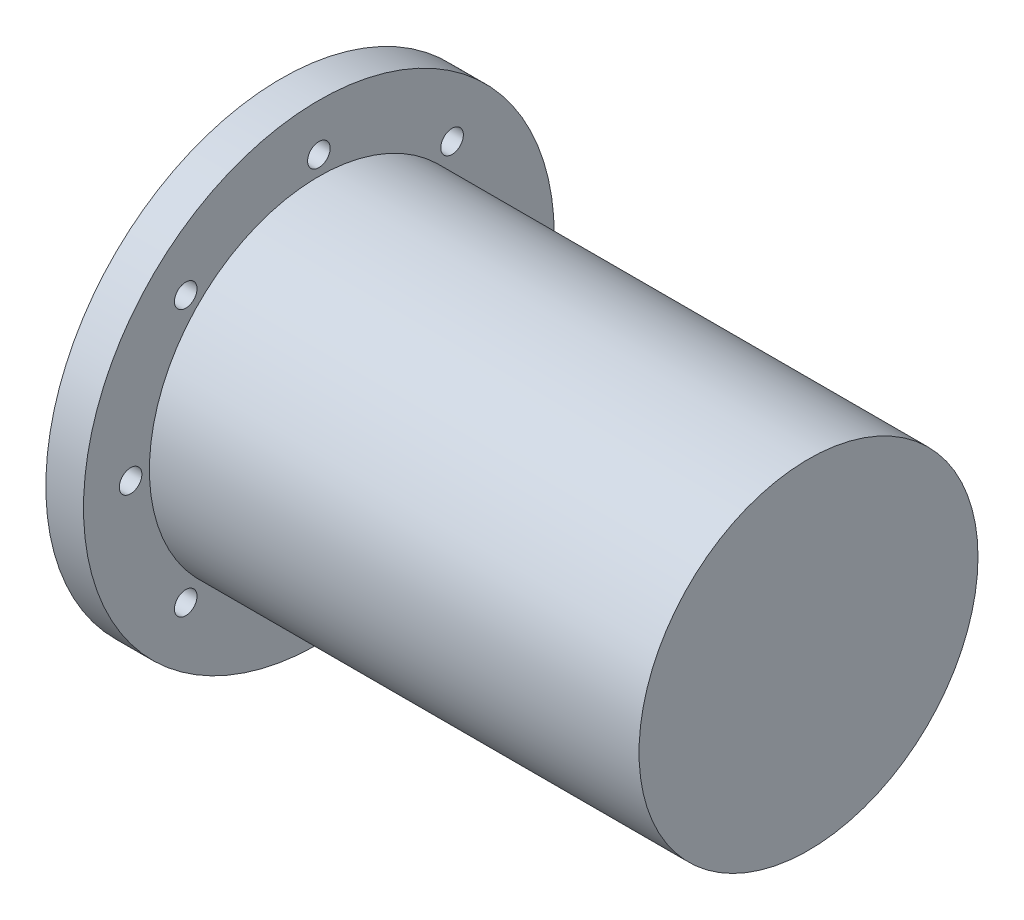
ISO-10303-21;
HEADER;
FILE_DESCRIPTION(('STEP AP214'),'2;1');
FILE_NAME('part.step','',(''),(''),'','','');
FILE_SCHEMA(('AUTOMOTIVE_DESIGN { 1 0 10303 214 1 1 1 1 }'));
ENDSEC;
DATA;
#1=APPLICATION_CONTEXT('core data for automotive mechanical design processes');
#2=APPLICATION_PROTOCOL_DEFINITION('international standard','automotive_design',2000,#1);
#3=PRODUCT_CONTEXT('',#1,'mechanical');
#4=PRODUCT('Part','Part','',(#3));
#5=PRODUCT_RELATED_PRODUCT_CATEGORY('part','',(#4));
#6=PRODUCT_DEFINITION_FORMATION('','',#4);
#7=PRODUCT_DEFINITION_CONTEXT('part definition',#1,'design');
#8=PRODUCT_DEFINITION('design','',#6,#7);
#9=PRODUCT_DEFINITION_SHAPE('','',#8);
#10=(LENGTH_UNIT() NAMED_UNIT(*) SI_UNIT(.MILLI.,.METRE.));
#11=(NAMED_UNIT(*) PLANE_ANGLE_UNIT() SI_UNIT($,.RADIAN.));
#12=(NAMED_UNIT(*) SI_UNIT($,.STERADIAN.) SOLID_ANGLE_UNIT());
#13=UNCERTAINTY_MEASURE_WITH_UNIT(LENGTH_MEASURE(1.E-05),#10,'distance_accuracy_value','');
#14=(GEOMETRIC_REPRESENTATION_CONTEXT(3) GLOBAL_UNCERTAINTY_ASSIGNED_CONTEXT((#13)) GLOBAL_UNIT_ASSIGNED_CONTEXT((#10,
#11,#12)) REPRESENTATION_CONTEXT('',''));
#15=CARTESIAN_POINT('',(0.,0.,0.));
#16=DIRECTION('',(0.,0.,1.));
#17=DIRECTION('',(1.,0.,0.));
#18=AXIS2_PLACEMENT_3D('',#15,#16,#17);
#19=CARTESIAN_POINT('',(20.,0.,0.));
#20=DIRECTION('',(1.,0.,0.));
#21=DIRECTION('',(0.,0.,-1.));
#22=AXIS2_PLACEMENT_3D('',#19,#20,#21);
#23=PLANE('',#22);
#24=CARTESIAN_POINT('',(20.,0.,0.));
#25=DIRECTION('',(1.,0.,0.));
#26=DIRECTION('',(0.,0.,-1.));
#27=AXIS2_PLACEMENT_3D('',#24,#25,#26);
#28=CIRCLE('',#27,90.);
#29=CARTESIAN_POINT('',(20.,0.,-90.));
#30=VERTEX_POINT('',#29);
#31=EDGE_CURVE('E10',#30,#30,#28,.T.);
#32=ORIENTED_EDGE('',*,*,#31,.F.);
#33=EDGE_LOOP('',(#32));
#34=FACE_BOUND('',#33,.T.);
#35=CARTESIAN_POINT('',(20.,-1.04907572146928E-12,-100.));
#36=DIRECTION('',(1.,0.,0.));
#37=DIRECTION('',(0.,0.,-1.));
#38=AXIS2_PLACEMENT_3D('',#35,#36,#37);
#39=CIRCLE('',#38,6.00000000000001);
#40=CARTESIAN_POINT('',(20.,-1.04907572146928E-12,-106.));
#41=VERTEX_POINT('',#40);
#42=EDGE_CURVE('E54',#41,#41,#39,.T.);
#43=ORIENTED_EDGE('',*,*,#42,.F.);
#44=EDGE_LOOP('',(#43));
#45=FACE_BOUND('',#44,.T.);
#46=CARTESIAN_POINT('',(20.,100.,-6.86049799777153E-13));
#47=DIRECTION('',(1.,0.,0.));
#48=DIRECTION('',(0.,0.,-1.));
#49=AXIS2_PLACEMENT_3D('',#46,#47,#48);
#50=CIRCLE('',#49,6.);
#51=CARTESIAN_POINT('',(20.,100.,-6.00000000000069));
#52=VERTEX_POINT('',#51);
#53=EDGE_CURVE('E66',#52,#52,#50,.T.);
#54=ORIENTED_EDGE('',*,*,#53,.F.);
#55=EDGE_LOOP('',(#54));
#56=FACE_BOUND('',#55,.T.);
#57=CARTESIAN_POINT('',(20.,3.3690166589284E-13,100.));
#58=DIRECTION('',(1.,0.,0.));
#59=DIRECTION('',(0.,0.,-1.));
#60=AXIS2_PLACEMENT_3D('',#57,#58,#59);
#61=CIRCLE('',#60,6.00000000000001);
#62=CARTESIAN_POINT('',(20.,3.3690166589284E-13,94.));
#63=VERTEX_POINT('',#62);
#64=EDGE_CURVE('E78',#63,#63,#61,.T.);
#65=ORIENTED_EDGE('',*,*,#64,.F.);
#66=EDGE_LOOP('',(#65));
#67=FACE_BOUND('',#66,.T.);
#68=CARTESIAN_POINT('',(20.,-100.,0.));
#69=DIRECTION('',(1.,0.,0.));
#70=DIRECTION('',(0.,0.,-1.));
#71=AXIS2_PLACEMENT_3D('',#68,#69,#70);
#72=CIRCLE('',#71,6.);
#73=CARTESIAN_POINT('',(20.,-100.,-6.00000000000002));
#74=VERTEX_POINT('',#73);
#75=EDGE_CURVE('E90',#74,#74,#72,.T.);
#76=ORIENTED_EDGE('',*,*,#75,.F.);
#77=EDGE_LOOP('',(#76));
#78=FACE_BOUND('',#77,.T.);
#79=CARTESIAN_POINT('',(20.,0.,0.));
#80=DIRECTION('',(1.,0.,0.));
#81=DIRECTION('',(0.,0.,-1.));
#82=AXIS2_PLACEMENT_3D('',#79,#80,#81);
#83=CIRCLE('',#82,125.);
#84=CARTESIAN_POINT('',(20.,0.,-125.));
#85=VERTEX_POINT('',#84);
#86=EDGE_CURVE('E39',#85,#85,#83,.T.);
#87=ORIENTED_EDGE('',*,*,#86,.T.);
#88=EDGE_LOOP('',(#87));
#89=FACE_BOUND('',#88,.T.);
#90=CARTESIAN_POINT('',(20.,-70.7106781186547,70.7106781186549));
#91=DIRECTION('',(1.,0.,0.));
#92=DIRECTION('',(0.,0.,-1.));
#93=AXIS2_PLACEMENT_3D('',#90,#91,#92);
#94=CIRCLE('',#93,6.);
#95=CARTESIAN_POINT('',(20.,-70.7106781186547,64.7106781186549));
#96=VERTEX_POINT('',#95);
#97=EDGE_CURVE('E84',#96,#96,#94,.T.);
#98=ORIENTED_EDGE('',*,*,#97,.F.);
#99=EDGE_LOOP('',(#98));
#100=FACE_BOUND('',#99,.T.);
#101=CARTESIAN_POINT('',(20.,70.7106781186551,70.7106781186544));
#102=DIRECTION('',(1.,0.,0.));
#103=DIRECTION('',(0.,0.,-1.));
#104=AXIS2_PLACEMENT_3D('',#101,#102,#103);
#105=CIRCLE('',#104,6.00000000000001);
#106=CARTESIAN_POINT('',(20.,70.7106781186551,64.7106781186544));
#107=VERTEX_POINT('',#106);
#108=EDGE_CURVE('E72',#107,#107,#105,.T.);
#109=ORIENTED_EDGE('',*,*,#108,.F.);
#110=EDGE_LOOP('',(#109));
#111=FACE_BOUND('',#110,.T.);
#112=CARTESIAN_POINT('',(20.,70.7106781186542,-70.7106781186554));
#113=DIRECTION('',(1.,0.,0.));
#114=DIRECTION('',(0.,0.,-1.));
#115=AXIS2_PLACEMENT_3D('',#112,#113,#114);
#116=CIRCLE('',#115,6.);
#117=CARTESIAN_POINT('',(20.,70.7106781186542,-76.7106781186554));
#118=VERTEX_POINT('',#117);
#119=EDGE_CURVE('E60',#118,#118,#116,.T.);
#120=ORIENTED_EDGE('',*,*,#119,.F.);
#121=EDGE_LOOP('',(#120));
#122=FACE_BOUND('',#121,.T.);
#123=CARTESIAN_POINT('',(20.,-70.7106781186556,-70.7106781186539));
#124=DIRECTION('',(1.,0.,0.));
#125=DIRECTION('',(0.,0.,-1.));
#126=AXIS2_PLACEMENT_3D('',#123,#124,#125);
#127=CIRCLE('',#126,6.);
#128=CARTESIAN_POINT('',(20.,-70.7106781186556,-76.7106781186539));
#129=VERTEX_POINT('',#128);
#130=EDGE_CURVE('E47',#129,#129,#127,.T.);
#131=ORIENTED_EDGE('',*,*,#130,.F.);
#132=EDGE_LOOP('',(#131));
#133=FACE_BOUND('',#132,.T.);
#134=ADVANCED_FACE('F31',(#34,#45,#56,#67,#78,#89,#100,#111,#122,#133),#23,.T.);
#135=CARTESIAN_POINT('',(0.,0.,0.));
#136=DIRECTION('',(1.,0.,0.));
#137=DIRECTION('',(0.,0.,-1.));
#138=AXIS2_PLACEMENT_3D('',#135,#136,#137);
#139=PLANE('',#138);
#140=CARTESIAN_POINT('',(0.,0.,0.));
#141=DIRECTION('',(1.,0.,0.));
#142=DIRECTION('',(0.,0.,-1.));
#143=AXIS2_PLACEMENT_3D('',#140,#141,#142);
#144=CIRCLE('',#143,125.);
#145=CARTESIAN_POINT('',(0.,0.,-125.));
#146=VERTEX_POINT('',#145);
#147=EDGE_CURVE('E35',#146,#146,#144,.T.);
#148=ORIENTED_EDGE('',*,*,#147,.F.);
#149=EDGE_LOOP('',(#148));
#150=FACE_BOUND('',#149,.T.);
#151=CARTESIAN_POINT('',(0.,-100.,0.));
#152=DIRECTION('',(1.,0.,0.));
#153=DIRECTION('',(0.,0.,-1.));
#154=AXIS2_PLACEMENT_3D('',#151,#152,#153);
#155=CIRCLE('',#154,6.);
#156=CARTESIAN_POINT('',(0.,-100.,-6.00000000000002));
#157=VERTEX_POINT('',#156);
#158=EDGE_CURVE('E87',#157,#157,#155,.T.);
#159=ORIENTED_EDGE('',*,*,#158,.T.);
#160=EDGE_LOOP('',(#159));
#161=FACE_BOUND('',#160,.T.);
#162=CARTESIAN_POINT('',(0.,-70.7106781186547,70.7106781186549));
#163=DIRECTION('',(1.,0.,0.));
#164=DIRECTION('',(0.,0.,-1.));
#165=AXIS2_PLACEMENT_3D('',#162,#163,#164);
#166=CIRCLE('',#165,6.);
#167=CARTESIAN_POINT('',(0.,-70.7106781186547,64.7106781186549));
#168=VERTEX_POINT('',#167);
#169=EDGE_CURVE('E81',#168,#168,#166,.T.);
#170=ORIENTED_EDGE('',*,*,#169,.T.);
#171=EDGE_LOOP('',(#170));
#172=FACE_BOUND('',#171,.T.);
#173=CARTESIAN_POINT('',(0.,3.3690166589284E-13,100.));
#174=DIRECTION('',(1.,0.,0.));
#175=DIRECTION('',(0.,0.,-1.));
#176=AXIS2_PLACEMENT_3D('',#173,#174,#175);
#177=CIRCLE('',#176,6.00000000000001);
#178=CARTESIAN_POINT('',(0.,3.3690166589284E-13,94.));
#179=VERTEX_POINT('',#178);
#180=EDGE_CURVE('E75',#179,#179,#177,.T.);
#181=ORIENTED_EDGE('',*,*,#180,.T.);
#182=EDGE_LOOP('',(#181));
#183=FACE_BOUND('',#182,.T.);
#184=CARTESIAN_POINT('',(0.,70.7106781186551,70.7106781186544));
#185=DIRECTION('',(1.,0.,0.));
#186=DIRECTION('',(0.,0.,-1.));
#187=AXIS2_PLACEMENT_3D('',#184,#185,#186);
#188=CIRCLE('',#187,6.00000000000001);
#189=CARTESIAN_POINT('',(0.,70.7106781186551,64.7106781186544));
#190=VERTEX_POINT('',#189);
#191=EDGE_CURVE('E69',#190,#190,#188,.T.);
#192=ORIENTED_EDGE('',*,*,#191,.T.);
#193=EDGE_LOOP('',(#192));
#194=FACE_BOUND('',#193,.T.);
#195=CARTESIAN_POINT('',(0.,100.,-6.86049799777153E-13));
#196=DIRECTION('',(1.,0.,0.));
#197=DIRECTION('',(0.,0.,-1.));
#198=AXIS2_PLACEMENT_3D('',#195,#196,#197);
#199=CIRCLE('',#198,6.);
#200=CARTESIAN_POINT('',(0.,100.,-6.00000000000069));
#201=VERTEX_POINT('',#200);
#202=EDGE_CURVE('E63',#201,#201,#199,.T.);
#203=ORIENTED_EDGE('',*,*,#202,.T.);
#204=EDGE_LOOP('',(#203));
#205=FACE_BOUND('',#204,.T.);
#206=CARTESIAN_POINT('',(0.,70.7106781186542,-70.7106781186554));
#207=DIRECTION('',(1.,0.,0.));
#208=DIRECTION('',(0.,0.,-1.));
#209=AXIS2_PLACEMENT_3D('',#206,#207,#208);
#210=CIRCLE('',#209,6.);
#211=CARTESIAN_POINT('',(0.,70.7106781186542,-76.7106781186554));
#212=VERTEX_POINT('',#211);
#213=EDGE_CURVE('E57',#212,#212,#210,.T.);
#214=ORIENTED_EDGE('',*,*,#213,.T.);
#215=EDGE_LOOP('',(#214));
#216=FACE_BOUND('',#215,.T.);
#217=CARTESIAN_POINT('',(0.,-1.04907572146928E-12,-100.));
#218=DIRECTION('',(1.,0.,0.));
#219=DIRECTION('',(0.,0.,-1.));
#220=AXIS2_PLACEMENT_3D('',#217,#218,#219);
#221=CIRCLE('',#220,6.00000000000001);
#222=CARTESIAN_POINT('',(0.,-1.04907572146928E-12,-106.));
#223=VERTEX_POINT('',#222);
#224=EDGE_CURVE('E50',#223,#223,#221,.T.);
#225=ORIENTED_EDGE('',*,*,#224,.T.);
#226=EDGE_LOOP('',(#225));
#227=FACE_BOUND('',#226,.T.);
#228=CARTESIAN_POINT('',(0.,-70.7106781186556,-70.7106781186539));
#229=DIRECTION('',(1.,0.,0.));
#230=DIRECTION('',(0.,0.,-1.));
#231=AXIS2_PLACEMENT_3D('',#228,#229,#230);
#232=CIRCLE('',#231,6.);
#233=CARTESIAN_POINT('',(0.,-70.7106781186556,-76.7106781186539));
#234=VERTEX_POINT('',#233);
#235=EDGE_CURVE('E51',#234,#234,#232,.T.);
#236=ORIENTED_EDGE('',*,*,#235,.T.);
#237=EDGE_LOOP('',(#236));
#238=FACE_BOUND('',#237,.T.);
#239=ADVANCED_FACE('F96',(#150,#161,#172,#183,#194,#205,#216,#227,#238),#139,.F.);
#240=CARTESIAN_POINT('',(20.,0.,0.));
#241=DIRECTION('',(-1.,0.,0.));
#242=DIRECTION('',(0.,0.,1.));
#243=AXIS2_PLACEMENT_3D('',#240,#241,#242);
#244=CYLINDRICAL_SURFACE('',#243,125.);
#245=ORIENTED_EDGE('',*,*,#86,.F.);
#246=EDGE_LOOP('',(#245));
#247=FACE_BOUND('',#246,.T.);
#248=ORIENTED_EDGE('',*,*,#147,.T.);
#249=EDGE_LOOP('',(#248));
#250=FACE_BOUND('',#249,.T.);
#251=ADVANCED_FACE('F33',(#247,#250),#244,.T.);
#252=CARTESIAN_POINT('',(20.,-100.,0.));
#253=DIRECTION('',(-1.,0.,0.));
#254=DIRECTION('',(0.,0.,1.));
#255=AXIS2_PLACEMENT_3D('',#252,#253,#254);
#256=CYLINDRICAL_SURFACE('',#255,6.);
#257=ORIENTED_EDGE('',*,*,#75,.T.);
#258=EDGE_LOOP('',(#257));
#259=FACE_BOUND('',#258,.T.);
#260=ORIENTED_EDGE('',*,*,#158,.F.);
#261=EDGE_LOOP('',(#260));
#262=FACE_BOUND('',#261,.T.);
#263=ADVANCED_FACE('F99',(#259,#262),#256,.F.);
#264=CARTESIAN_POINT('',(20.,-70.7106781186547,70.7106781186549));
#265=DIRECTION('',(-1.,0.,0.));
#266=DIRECTION('',(0.,0.,1.));
#267=AXIS2_PLACEMENT_3D('',#264,#265,#266);
#268=CYLINDRICAL_SURFACE('',#267,6.);
#269=ORIENTED_EDGE('',*,*,#97,.T.);
#270=EDGE_LOOP('',(#269));
#271=FACE_BOUND('',#270,.T.);
#272=ORIENTED_EDGE('',*,*,#169,.F.);
#273=EDGE_LOOP('',(#272));
#274=FACE_BOUND('',#273,.T.);
#275=ADVANCED_FACE('F101',(#271,#274),#268,.F.);
#276=CARTESIAN_POINT('',(20.,3.3690166589284E-13,100.));
#277=DIRECTION('',(-1.,0.,0.));
#278=DIRECTION('',(0.,0.,1.));
#279=AXIS2_PLACEMENT_3D('',#276,#277,#278);
#280=CYLINDRICAL_SURFACE('',#279,6.00000000000001);
#281=ORIENTED_EDGE('',*,*,#64,.T.);
#282=EDGE_LOOP('',(#281));
#283=FACE_BOUND('',#282,.T.);
#284=ORIENTED_EDGE('',*,*,#180,.F.);
#285=EDGE_LOOP('',(#284));
#286=FACE_BOUND('',#285,.T.);
#287=ADVANCED_FACE('F108',(#283,#286),#280,.F.);
#288=CARTESIAN_POINT('',(20.,70.7106781186551,70.7106781186544));
#289=DIRECTION('',(-1.,0.,0.));
#290=DIRECTION('',(0.,0.,1.));
#291=AXIS2_PLACEMENT_3D('',#288,#289,#290);
#292=CYLINDRICAL_SURFACE('',#291,6.00000000000001);
#293=ORIENTED_EDGE('',*,*,#108,.T.);
#294=EDGE_LOOP('',(#293));
#295=FACE_BOUND('',#294,.T.);
#296=ORIENTED_EDGE('',*,*,#191,.F.);
#297=EDGE_LOOP('',(#296));
#298=FACE_BOUND('',#297,.T.);
#299=ADVANCED_FACE('F164',(#295,#298),#292,.F.);
#300=CARTESIAN_POINT('',(20.,100.,-6.86049799777153E-13));
#301=DIRECTION('',(-1.,0.,0.));
#302=DIRECTION('',(0.,0.,1.));
#303=AXIS2_PLACEMENT_3D('',#300,#301,#302);
#304=CYLINDRICAL_SURFACE('',#303,6.);
#305=ORIENTED_EDGE('',*,*,#53,.T.);
#306=EDGE_LOOP('',(#305));
#307=FACE_BOUND('',#306,.T.);
#308=ORIENTED_EDGE('',*,*,#202,.F.);
#309=EDGE_LOOP('',(#308));
#310=FACE_BOUND('',#309,.T.);
#311=ADVANCED_FACE('F160',(#307,#310),#304,.F.);
#312=CARTESIAN_POINT('',(20.,70.7106781186542,-70.7106781186554));
#313=DIRECTION('',(-1.,0.,0.));
#314=DIRECTION('',(0.,0.,1.));
#315=AXIS2_PLACEMENT_3D('',#312,#313,#314);
#316=CYLINDRICAL_SURFACE('',#315,6.);
#317=ORIENTED_EDGE('',*,*,#119,.T.);
#318=EDGE_LOOP('',(#317));
#319=FACE_BOUND('',#318,.T.);
#320=ORIENTED_EDGE('',*,*,#213,.F.);
#321=EDGE_LOOP('',(#320));
#322=FACE_BOUND('',#321,.T.);
#323=ADVANCED_FACE('F153',(#319,#322),#316,.F.);
#324=CARTESIAN_POINT('',(20.,-1.04907572146928E-12,-100.));
#325=DIRECTION('',(-1.,0.,0.));
#326=DIRECTION('',(0.,0.,1.));
#327=AXIS2_PLACEMENT_3D('',#324,#325,#326);
#328=CYLINDRICAL_SURFACE('',#327,6.00000000000001);
#329=ORIENTED_EDGE('',*,*,#42,.T.);
#330=EDGE_LOOP('',(#329));
#331=FACE_BOUND('',#330,.T.);
#332=ORIENTED_EDGE('',*,*,#224,.F.);
#333=EDGE_LOOP('',(#332));
#334=FACE_BOUND('',#333,.T.);
#335=ADVANCED_FACE('F142',(#331,#334),#328,.F.);
#336=CARTESIAN_POINT('',(20.,-70.7106781186556,-70.7106781186539));
#337=DIRECTION('',(-1.,0.,0.));
#338=DIRECTION('',(0.,0.,1.));
#339=AXIS2_PLACEMENT_3D('',#336,#337,#338);
#340=CYLINDRICAL_SURFACE('',#339,6.);
#341=ORIENTED_EDGE('',*,*,#130,.T.);
#342=EDGE_LOOP('',(#341));
#343=FACE_BOUND('',#342,.T.);
#344=ORIENTED_EDGE('',*,*,#235,.F.);
#345=EDGE_LOOP('',(#344));
#346=FACE_BOUND('',#345,.T.);
#347=ADVANCED_FACE('F138',(#343,#346),#340,.F.);
#348=CARTESIAN_POINT('',(280.,0.,0.));
#349=DIRECTION('',(-1.,0.,0.));
#350=DIRECTION('',(0.,0.,1.));
#351=AXIS2_PLACEMENT_3D('',#348,#349,#350);
#352=CYLINDRICAL_SURFACE('',#351,90.);
#353=CARTESIAN_POINT('',(280.,0.,0.));
#354=DIRECTION('',(1.,0.,0.));
#355=DIRECTION('',(0.,0.,-1.));
#356=AXIS2_PLACEMENT_3D('',#353,#354,#355);
#357=CIRCLE('',#356,90.);
#358=CARTESIAN_POINT('',(280.,0.,-90.));
#359=VERTEX_POINT('',#358);
#360=EDGE_CURVE('E46',#359,#359,#357,.T.);
#361=ORIENTED_EDGE('',*,*,#360,.F.);
#362=EDGE_LOOP('',(#361));
#363=FACE_BOUND('',#362,.T.);
#364=ORIENTED_EDGE('',*,*,#31,.T.);
#365=EDGE_LOOP('',(#364));
#366=FACE_BOUND('',#365,.T.);
#367=ADVANCED_FACE('F141',(#363,#366),#352,.T.);
#368=CARTESIAN_POINT('',(280.,0.,0.));
#369=DIRECTION('',(1.,0.,0.));
#370=DIRECTION('',(0.,0.,-1.));
#371=AXIS2_PLACEMENT_3D('',#368,#369,#370);
#372=PLANE('',#371);
#373=ORIENTED_EDGE('',*,*,#360,.T.);
#374=EDGE_LOOP('',(#373));
#375=FACE_BOUND('',#374,.T.);
#376=ADVANCED_FACE('F150',(#375),#372,.T.);
#377=CLOSED_SHELL('',(#134,#239,#251,#263,#275,#287,#299,#311,#323,#335,#347,#367,#376));
#378=MANIFOLD_SOLID_BREP('B2',#377);
#379=ADVANCED_BREP_SHAPE_REPRESENTATION('',(#18,#378),#14);
#380=SHAPE_DEFINITION_REPRESENTATION(#9,#379);
ENDSEC;
END-ISO-10303-21;
